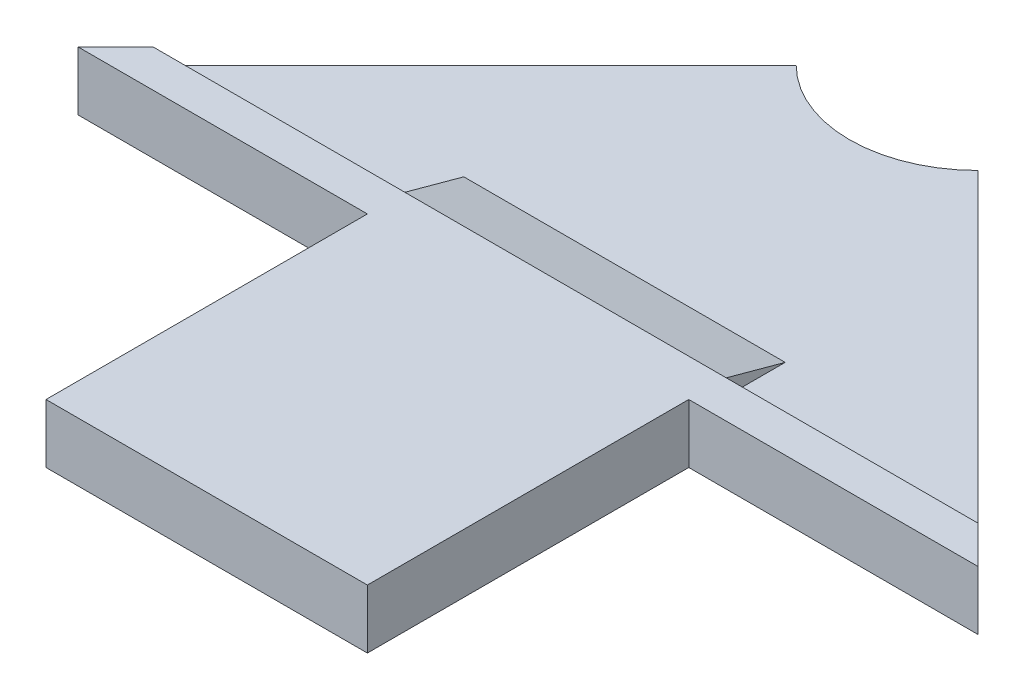
ISO-10303-21;
HEADER;
FILE_DESCRIPTION(('STEP AP214'),'2;1');
FILE_NAME('part.step','',(''),(''),'','','');
FILE_SCHEMA(('AUTOMOTIVE_DESIGN { 1 0 10303 214 1 1 1 1 }'));
ENDSEC;
DATA;
#1=APPLICATION_CONTEXT('core data for automotive mechanical design processes');
#2=APPLICATION_PROTOCOL_DEFINITION('international standard','automotive_design',2000,#1);
#3=PRODUCT_CONTEXT('',#1,'mechanical');
#4=PRODUCT('Part','Part','',(#3));
#5=PRODUCT_RELATED_PRODUCT_CATEGORY('part','',(#4));
#6=PRODUCT_DEFINITION_FORMATION('','',#4);
#7=PRODUCT_DEFINITION_CONTEXT('part definition',#1,'design');
#8=PRODUCT_DEFINITION('design','',#6,#7);
#9=PRODUCT_DEFINITION_SHAPE('','',#8);
#10=(LENGTH_UNIT() NAMED_UNIT(*) SI_UNIT(.MILLI.,.METRE.));
#11=(NAMED_UNIT(*) PLANE_ANGLE_UNIT() SI_UNIT($,.RADIAN.));
#12=(NAMED_UNIT(*) SI_UNIT($,.STERADIAN.) SOLID_ANGLE_UNIT());
#13=UNCERTAINTY_MEASURE_WITH_UNIT(LENGTH_MEASURE(1.E-05),#10,'distance_accuracy_value','');
#14=(GEOMETRIC_REPRESENTATION_CONTEXT(3) GLOBAL_UNCERTAINTY_ASSIGNED_CONTEXT((#13)) GLOBAL_UNIT_ASSIGNED_CONTEXT((#10,
#11,#12)) REPRESENTATION_CONTEXT('',''));
#15=CARTESIAN_POINT('',(0.,0.,0.));
#16=DIRECTION('',(0.,0.,1.));
#17=DIRECTION('',(1.,0.,0.));
#18=AXIS2_PLACEMENT_3D('',#15,#16,#17);
#19=CARTESIAN_POINT('',(0.,139.7,977.9));
#20=DIRECTION('',(0.,0.,-1.));
#21=DIRECTION('',(-1.,0.,0.));
#22=AXIS2_PLACEMENT_3D('',#19,#20,#21);
#23=PLANE('',#22);
#24=DIRECTION('',(1.,0.,0.));
#25=VECTOR('',#24,1.);
#26=CARTESIAN_POINT('',(0.,101.6,977.9));
#27=LINE('',#26,#25);
#28=CARTESIAN_POINT('',(381.,101.6,977.9));
#29=VERTEX_POINT('',#28);
#30=CARTESIAN_POINT('',(977.900000000001,101.6,977.900000000001));
#31=VERTEX_POINT('',#30);
#32=EDGE_CURVE('E196',#29,#31,#27,.T.);
#33=ORIENTED_EDGE('',*,*,#32,.F.);
#34=DIRECTION('',(0.,-1.,0.));
#35=VECTOR('',#34,1.);
#36=CARTESIAN_POINT('',(381.,101.6,977.9));
#37=LINE('',#36,#35);
#38=CARTESIAN_POINT('',(381.,139.7,977.9));
#39=VERTEX_POINT('',#38);
#40=EDGE_CURVE('E87',#39,#29,#37,.T.);
#41=ORIENTED_EDGE('',*,*,#40,.F.);
#42=DIRECTION('',(1.,0.,0.));
#43=VECTOR('',#42,1.);
#44=CARTESIAN_POINT('',(0.,139.7,977.9));
#45=LINE('',#44,#43);
#46=CARTESIAN_POINT('',(977.900000000001,139.7,977.900000000001));
#47=VERTEX_POINT('',#46);
#48=EDGE_CURVE('E220',#39,#47,#45,.T.);
#49=ORIENTED_EDGE('',*,*,#48,.T.);
#50=DIRECTION('',(0.,-1.,0.));
#51=VECTOR('',#50,1.);
#52=CARTESIAN_POINT('',(977.900000000001,139.7,977.900000000001));
#53=LINE('',#52,#51);
#54=EDGE_CURVE('E256',#47,#31,#53,.T.);
#55=ORIENTED_EDGE('',*,*,#54,.T.);
#56=EDGE_LOOP('',(#33,#41,#49,#55));
#57=FACE_BOUND('',#56,.T.);
#58=ADVANCED_FACE('F72',(#57),#23,.T.);
#59=CARTESIAN_POINT('',(381.,139.7,0.));
#60=DIRECTION('',(1.,0.,0.));
#61=DIRECTION('',(0.,0.,-1.));
#62=AXIS2_PLACEMENT_3D('',#59,#60,#61);
#63=PLANE('',#62);
#64=DIRECTION('',(0.,0.,1.));
#65=VECTOR('',#64,1.);
#66=CARTESIAN_POINT('',(381.,0.,0.));
#67=LINE('',#66,#65);
#68=CARTESIAN_POINT('',(381.,0.,1066.8));
#69=VERTEX_POINT('',#68);
#70=CARTESIAN_POINT('',(381.,0.,1828.8));
#71=VERTEX_POINT('',#70);
#72=EDGE_CURVE('E209',#69,#71,#67,.T.);
#73=ORIENTED_EDGE('',*,*,#72,.F.);
#74=DIRECTION('',(0.,-1.,0.));
#75=VECTOR('',#74,1.);
#76=CARTESIAN_POINT('',(381.,139.7,1066.8));
#77=LINE('',#76,#75);
#78=CARTESIAN_POINT('',(381.,139.7,1066.8));
#79=VERTEX_POINT('',#78);
#80=EDGE_CURVE('E12',#79,#69,#77,.T.);
#81=ORIENTED_EDGE('',*,*,#80,.F.);
#82=DIRECTION('',(0.,0.,1.));
#83=VECTOR('',#82,1.);
#84=CARTESIAN_POINT('',(381.,139.7,0.));
#85=LINE('',#84,#83);
#86=CARTESIAN_POINT('',(381.,139.7,1828.8));
#87=VERTEX_POINT('',#86);
#88=EDGE_CURVE('E210',#79,#87,#85,.T.);
#89=ORIENTED_EDGE('',*,*,#88,.T.);
#90=DIRECTION('',(0.,-1.,0.));
#91=VECTOR('',#90,1.);
#92=CARTESIAN_POINT('',(381.,139.7,1828.8));
#93=LINE('',#92,#91);
#94=EDGE_CURVE('E231',#87,#71,#93,.T.);
#95=ORIENTED_EDGE('',*,*,#94,.T.);
#96=EDGE_LOOP('',(#73,#81,#89,#95));
#97=FACE_BOUND('',#96,.T.);
#98=ADVANCED_FACE('F74',(#97),#63,.T.);
#99=CARTESIAN_POINT('',(6.90805437544542E-13,139.7,1066.8));
#100=DIRECTION('',(0.,0.,-1.));
#101=DIRECTION('',(-1.,0.,0.));
#102=AXIS2_PLACEMENT_3D('',#99,#100,#101);
#103=PLANE('',#102);
#104=DIRECTION('',(1.,0.,0.));
#105=VECTOR('',#104,1.);
#106=CARTESIAN_POINT('',(6.90805437544542E-13,0.,1066.8));
#107=LINE('',#106,#105);
#108=CARTESIAN_POINT('',(1066.8,0.,1066.8));
#109=VERTEX_POINT('',#108);
#110=EDGE_CURVE('E234',#69,#109,#107,.T.);
#111=ORIENTED_EDGE('',*,*,#110,.T.);
#112=DIRECTION('',(0.,-1.,0.));
#113=VECTOR('',#112,1.);
#114=CARTESIAN_POINT('',(1066.8,139.7,1066.8));
#115=LINE('',#114,#113);
#116=CARTESIAN_POINT('',(1066.8,139.7,1066.8));
#117=VERTEX_POINT('',#116);
#118=EDGE_CURVE('E80',#117,#109,#115,.T.);
#119=ORIENTED_EDGE('',*,*,#118,.F.);
#120=DIRECTION('',(1.,0.,0.));
#121=VECTOR('',#120,1.);
#122=CARTESIAN_POINT('',(6.90805437544542E-13,139.7,1066.8));
#123=LINE('',#122,#121);
#124=EDGE_CURVE('E213',#79,#117,#123,.T.);
#125=ORIENTED_EDGE('',*,*,#124,.F.);
#126=ORIENTED_EDGE('',*,*,#80,.T.);
#127=EDGE_LOOP('',(#111,#119,#125,#126));
#128=FACE_BOUND('',#127,.T.);
#129=ADVANCED_FACE('F284',(#128),#103,.F.);
#130=CARTESIAN_POINT('',(4.00373576964364E-12,139.7,-4.00373576964361E-12));
#131=DIRECTION('',(-0.70710678118655,0.,0.707106781186545));
#132=DIRECTION('',(0.707106781186545,0.,0.70710678118655));
#133=AXIS2_PLACEMENT_3D('',#130,#131,#132);
#134=PLANE('',#133);
#135=DIRECTION('',(-0.707106781186545,0.,-0.70710678118655));
#136=VECTOR('',#135,1.);
#137=CARTESIAN_POINT('',(4.00373576964364E-12,0.,-4.00373576964361E-12));
#138=LINE('',#137,#136);
#139=CARTESIAN_POINT('',(215.526146905659,0.,215.526146905659));
#140=VERTEX_POINT('',#139);
#141=EDGE_CURVE('E236',#109,#140,#138,.T.);
#142=ORIENTED_EDGE('',*,*,#141,.T.);
#143=DIRECTION('',(0.,-1.,0.));
#144=VECTOR('',#143,1.);
#145=CARTESIAN_POINT('',(215.526146905659,101.6,215.526146905659));
#146=LINE('',#145,#144);
#147=CARTESIAN_POINT('',(215.526146905659,101.6,215.526146905659));
#148=VERTEX_POINT('',#147);
#149=EDGE_CURVE('E201',#148,#140,#146,.T.);
#150=ORIENTED_EDGE('',*,*,#149,.F.);
#151=DIRECTION('',(0.707106781186548,0.,0.707106781186547));
#152=VECTOR('',#151,1.);
#153=CARTESIAN_POINT('',(0.,101.6,0.));
#154=LINE('',#153,#152);
#155=EDGE_CURVE('E198',#148,#31,#154,.T.);
#156=ORIENTED_EDGE('',*,*,#155,.T.);
#157=ORIENTED_EDGE('',*,*,#54,.F.);
#158=DIRECTION('',(-0.707106781186545,0.,-0.70710678118655));
#159=VECTOR('',#158,1.);
#160=CARTESIAN_POINT('',(4.00373576964364E-12,139.7,-4.00373576964361E-12));
#161=LINE('',#160,#159);
#162=EDGE_CURVE('E216',#117,#47,#161,.T.);
#163=ORIENTED_EDGE('',*,*,#162,.F.);
#164=ORIENTED_EDGE('',*,*,#118,.T.);
#165=EDGE_LOOP('',(#142,#150,#156,#157,#163,#164));
#166=FACE_BOUND('',#165,.T.);
#167=ADVANCED_FACE('F263',(#166),#134,.F.);
#168=DIRECTION('',(0.,-1.,0.));
#169=VECTOR('',#168,1.);
#170=CARTESIAN_POINT('',(-381.,101.6,977.9));
#171=LINE('',#170,#169);
#172=CARTESIAN_POINT('',(-381.,139.7,977.9));
#173=VERTEX_POINT('',#172);
#174=CARTESIAN_POINT('',(-381.,101.6,977.9));
#175=VERTEX_POINT('',#174);
#176=EDGE_CURVE('E183',#173,#175,#171,.T.);
#177=ORIENTED_EDGE('',*,*,#176,.T.);
#178=CARTESIAN_POINT('',(-977.9,101.6,977.9));
#179=VERTEX_POINT('',#178);
#180=EDGE_CURVE('E95',#179,#175,#27,.T.);
#181=ORIENTED_EDGE('',*,*,#180,.F.);
#182=DIRECTION('',(0.,-1.,0.));
#183=VECTOR('',#182,1.);
#184=CARTESIAN_POINT('',(-977.9,139.7,977.9));
#185=LINE('',#184,#183);
#186=CARTESIAN_POINT('',(-977.9,139.7,977.9));
#187=VERTEX_POINT('',#186);
#188=EDGE_CURVE('E254',#187,#179,#185,.T.);
#189=ORIENTED_EDGE('',*,*,#188,.F.);
#190=EDGE_CURVE('E221',#187,#173,#45,.T.);
#191=ORIENTED_EDGE('',*,*,#190,.T.);
#192=EDGE_LOOP('',(#177,#181,#189,#191));
#193=FACE_BOUND('',#192,.T.);
#194=ADVANCED_FACE('F304',(#193),#23,.T.);
#195=CARTESIAN_POINT('',(2.35513868802566E-13,139.7,2.35513868802566E-13));
#196=DIRECTION('',(-0.707106781186548,0.,-0.707106781186548));
#197=DIRECTION('',(-0.707106781186548,0.,0.707106781186548));
#198=AXIS2_PLACEMENT_3D('',#195,#196,#197);
#199=PLANE('',#198);
#200=DIRECTION('',(0.707106781186548,0.,-0.707106781186548));
#201=VECTOR('',#200,1.);
#202=CARTESIAN_POINT('',(2.35513868802566E-13,0.,2.35513868802566E-13));
#203=LINE('',#202,#201);
#204=CARTESIAN_POINT('',(-1066.8,0.,1066.8));
#205=VERTEX_POINT('',#204);
#206=CARTESIAN_POINT('',(-215.526146905659,0.,215.526146905659));
#207=VERTEX_POINT('',#206);
#208=EDGE_CURVE('E239',#205,#207,#203,.T.);
#209=ORIENTED_EDGE('',*,*,#208,.F.);
#210=DIRECTION('',(0.,-1.,0.));
#211=VECTOR('',#210,1.);
#212=CARTESIAN_POINT('',(-1066.8,139.7,1066.8));
#213=LINE('',#212,#211);
#214=CARTESIAN_POINT('',(-1066.8,139.7,1066.8));
#215=VERTEX_POINT('',#214);
#216=EDGE_CURVE('E252',#215,#205,#213,.T.);
#217=ORIENTED_EDGE('',*,*,#216,.F.);
#218=DIRECTION('',(0.707106781186548,0.,-0.707106781186548));
#219=VECTOR('',#218,1.);
#220=CARTESIAN_POINT('',(2.35513868802566E-13,139.7,2.35513868802566E-13));
#221=LINE('',#220,#219);
#222=EDGE_CURVE('E224',#215,#187,#221,.T.);
#223=ORIENTED_EDGE('',*,*,#222,.T.);
#224=ORIENTED_EDGE('',*,*,#188,.T.);
#225=DIRECTION('',(0.707106781186547,0.,-0.707106781186548));
#226=VECTOR('',#225,1.);
#227=CARTESIAN_POINT('',(0.,101.6,0.));
#228=LINE('',#227,#226);
#229=CARTESIAN_POINT('',(-215.526146905659,101.6,215.526146905659));
#230=VERTEX_POINT('',#229);
#231=EDGE_CURVE('E193',#179,#230,#228,.T.);
#232=ORIENTED_EDGE('',*,*,#231,.T.);
#233=DIRECTION('',(0.,-1.,0.));
#234=VECTOR('',#233,1.);
#235=CARTESIAN_POINT('',(-215.526146905659,101.6,215.526146905659));
#236=LINE('',#235,#234);
#237=EDGE_CURVE('E206',#230,#207,#236,.T.);
#238=ORIENTED_EDGE('',*,*,#237,.T.);
#239=EDGE_LOOP('',(#209,#217,#223,#224,#232,#238));
#240=FACE_BOUND('',#239,.T.);
#241=ADVANCED_FACE('F302',(#240),#199,.T.);
#242=CARTESIAN_POINT('',(-381.,0.,1066.8));
#243=VERTEX_POINT('',#242);
#244=EDGE_CURVE('E237',#205,#243,#107,.T.);
#245=ORIENTED_EDGE('',*,*,#244,.T.);
#246=DIRECTION('',(0.,-1.,0.));
#247=VECTOR('',#246,1.);
#248=CARTESIAN_POINT('',(-381.,139.7,1066.8));
#249=LINE('',#248,#247);
#250=CARTESIAN_POINT('',(-381.,139.7,1066.8));
#251=VERTEX_POINT('',#250);
#252=EDGE_CURVE('E249',#251,#243,#249,.T.);
#253=ORIENTED_EDGE('',*,*,#252,.F.);
#254=EDGE_CURVE('E217',#215,#251,#123,.T.);
#255=ORIENTED_EDGE('',*,*,#254,.F.);
#256=ORIENTED_EDGE('',*,*,#216,.T.);
#257=EDGE_LOOP('',(#245,#253,#255,#256));
#258=FACE_BOUND('',#257,.T.);
#259=ADVANCED_FACE('F299',(#258),#103,.F.);
#260=CARTESIAN_POINT('',(-381.,139.7,0.));
#261=DIRECTION('',(1.,0.,0.));
#262=DIRECTION('',(0.,0.,-1.));
#263=AXIS2_PLACEMENT_3D('',#260,#261,#262);
#264=PLANE('',#263);
#265=DIRECTION('',(0.,0.,1.));
#266=VECTOR('',#265,1.);
#267=CARTESIAN_POINT('',(-381.,0.,0.));
#268=LINE('',#267,#266);
#269=CARTESIAN_POINT('',(-381.,0.,1828.8));
#270=VERTEX_POINT('',#269);
#271=EDGE_CURVE('E241',#243,#270,#268,.T.);
#272=ORIENTED_EDGE('',*,*,#271,.T.);
#273=DIRECTION('',(0.,-1.,0.));
#274=VECTOR('',#273,1.);
#275=CARTESIAN_POINT('',(-381.,139.7,1828.8));
#276=LINE('',#275,#274);
#277=CARTESIAN_POINT('',(-381.,139.7,1828.8));
#278=VERTEX_POINT('',#277);
#279=EDGE_CURVE('E246',#278,#270,#276,.T.);
#280=ORIENTED_EDGE('',*,*,#279,.F.);
#281=DIRECTION('',(0.,0.,1.));
#282=VECTOR('',#281,1.);
#283=CARTESIAN_POINT('',(-381.,139.7,0.));
#284=LINE('',#283,#282);
#285=EDGE_CURVE('E227',#251,#278,#284,.T.);
#286=ORIENTED_EDGE('',*,*,#285,.F.);
#287=ORIENTED_EDGE('',*,*,#252,.T.);
#288=EDGE_LOOP('',(#272,#280,#286,#287));
#289=FACE_BOUND('',#288,.T.);
#290=ADVANCED_FACE('F295',(#289),#264,.F.);
#291=CARTESIAN_POINT('',(0.,139.7,1828.8));
#292=DIRECTION('',(0.,0.,-1.));
#293=DIRECTION('',(-1.,0.,0.));
#294=AXIS2_PLACEMENT_3D('',#291,#292,#293);
#295=PLANE('',#294);
#296=DIRECTION('',(1.,0.,0.));
#297=VECTOR('',#296,1.);
#298=CARTESIAN_POINT('',(0.,0.,1828.8));
#299=LINE('',#298,#297);
#300=EDGE_CURVE('E214',#270,#71,#299,.T.);
#301=ORIENTED_EDGE('',*,*,#300,.T.);
#302=ORIENTED_EDGE('',*,*,#94,.F.);
#303=DIRECTION('',(1.,0.,0.));
#304=VECTOR('',#303,1.);
#305=CARTESIAN_POINT('',(0.,139.7,1828.8));
#306=LINE('',#305,#304);
#307=EDGE_CURVE('E229',#278,#87,#306,.T.);
#308=ORIENTED_EDGE('',*,*,#307,.F.);
#309=ORIENTED_EDGE('',*,*,#279,.T.);
#310=EDGE_LOOP('',(#301,#302,#308,#309));
#311=FACE_BOUND('',#310,.T.);
#312=ADVANCED_FACE('F290',(#311),#295,.F.);
#313=CARTESIAN_POINT('',(0.,139.7,0.));
#314=DIRECTION('',(0.,1.,0.));
#315=DIRECTION('',(0.,0.,1.));
#316=AXIS2_PLACEMENT_3D('',#313,#314,#315);
#317=PLANE('',#316);
#318=ORIENTED_EDGE('',*,*,#88,.F.);
#319=ORIENTED_EDGE('',*,*,#124,.T.);
#320=ORIENTED_EDGE('',*,*,#162,.T.);
#321=ORIENTED_EDGE('',*,*,#48,.F.);
#322=DIRECTION('',(1.,0.,0.));
#323=VECTOR('',#322,1.);
#324=CARTESIAN_POINT('',(-381.,139.7,977.9));
#325=LINE('',#324,#323);
#326=EDGE_CURVE('E173',#173,#39,#325,.T.);
#327=ORIENTED_EDGE('',*,*,#326,.F.);
#328=ORIENTED_EDGE('',*,*,#190,.F.);
#329=ORIENTED_EDGE('',*,*,#222,.F.);
#330=ORIENTED_EDGE('',*,*,#254,.T.);
#331=ORIENTED_EDGE('',*,*,#285,.T.);
#332=ORIENTED_EDGE('',*,*,#307,.T.);
#333=EDGE_LOOP('',(#318,#319,#320,#321,#327,#328,#329,#330,#331,#332));
#334=FACE_BOUND('',#333,.T.);
#335=ADVANCED_FACE('F283',(#334),#317,.T.);
#336=CARTESIAN_POINT('',(0.,0.,0.));
#337=DIRECTION('',(0.,1.,0.));
#338=DIRECTION('',(0.,0.,1.));
#339=AXIS2_PLACEMENT_3D('',#336,#337,#338);
#340=PLANE('',#339);
#341=ORIENTED_EDGE('',*,*,#72,.T.);
#342=ORIENTED_EDGE('',*,*,#300,.F.);
#343=ORIENTED_EDGE('',*,*,#271,.F.);
#344=ORIENTED_EDGE('',*,*,#244,.F.);
#345=ORIENTED_EDGE('',*,*,#208,.T.);
#346=CARTESIAN_POINT('',(0.,0.,-7.7715611723761E-13));
#347=DIRECTION('',(0.,1.,0.));
#348=DIRECTION('',(0.,0.,1.));
#349=AXIS2_PLACEMENT_3D('',#346,#347,#348);
#350=CIRCLE('',#349,304.8);
#351=EDGE_CURVE('E185',#207,#140,#350,.T.);
#352=ORIENTED_EDGE('',*,*,#351,.T.);
#353=ORIENTED_EDGE('',*,*,#141,.F.);
#354=ORIENTED_EDGE('',*,*,#110,.F.);
#355=EDGE_LOOP('',(#341,#342,#343,#344,#345,#352,#353,#354));
#356=FACE_BOUND('',#355,.T.);
#357=ADVANCED_FACE('F269',(#356),#340,.F.);
#358=CARTESIAN_POINT('',(0.,101.6,-7.7715611723761E-13));
#359=DIRECTION('',(0.,-1.,0.));
#360=DIRECTION('',(0.,0.,-1.));
#361=AXIS2_PLACEMENT_3D('',#358,#359,#360);
#362=CYLINDRICAL_SURFACE('',#361,304.8);
#363=ORIENTED_EDGE('',*,*,#351,.F.);
#364=ORIENTED_EDGE('',*,*,#237,.F.);
#365=CARTESIAN_POINT('',(0.,101.6,-7.7715611723761E-13));
#366=DIRECTION('',(0.,1.,0.));
#367=DIRECTION('',(0.,0.,1.));
#368=AXIS2_PLACEMENT_3D('',#365,#366,#367);
#369=CIRCLE('',#368,304.8);
#370=EDGE_CURVE('E190',#230,#148,#369,.T.);
#371=ORIENTED_EDGE('',*,*,#370,.T.);
#372=ORIENTED_EDGE('',*,*,#149,.T.);
#373=EDGE_LOOP('',(#363,#364,#371,#372));
#374=FACE_BOUND('',#373,.T.);
#375=ADVANCED_FACE('F275',(#374),#362,.F.);
#376=CARTESIAN_POINT('',(0.,101.6,0.));
#377=DIRECTION('',(0.,1.,0.));
#378=DIRECTION('',(0.,0.,1.));
#379=AXIS2_PLACEMENT_3D('',#376,#377,#378);
#380=PLANE('',#379);
#381=DIRECTION('',(0.,0.,-1.));
#382=VECTOR('',#381,1.);
#383=CARTESIAN_POINT('',(-381.,101.6,838.200000000001));
#384=LINE('',#383,#382);
#385=CARTESIAN_POINT('',(-381.,101.6,838.200000000001));
#386=VERTEX_POINT('',#385);
#387=EDGE_CURVE('E182',#175,#386,#384,.T.);
#388=ORIENTED_EDGE('',*,*,#387,.T.);
#389=DIRECTION('',(1.,0.,0.));
#390=VECTOR('',#389,1.);
#391=CARTESIAN_POINT('',(-381.,101.6,838.200000000001));
#392=LINE('',#391,#390);
#393=CARTESIAN_POINT('',(381.,101.6,838.200000000001));
#394=VERTEX_POINT('',#393);
#395=EDGE_CURVE('E170',#386,#394,#392,.T.);
#396=ORIENTED_EDGE('',*,*,#395,.T.);
#397=DIRECTION('',(0.,0.,-1.));
#398=VECTOR('',#397,1.);
#399=CARTESIAN_POINT('',(381.,101.6,838.200000000001));
#400=LINE('',#399,#398);
#401=EDGE_CURVE('E174',#29,#394,#400,.T.);
#402=ORIENTED_EDGE('',*,*,#401,.F.);
#403=ORIENTED_EDGE('',*,*,#32,.T.);
#404=ORIENTED_EDGE('',*,*,#155,.F.);
#405=ORIENTED_EDGE('',*,*,#370,.F.);
#406=ORIENTED_EDGE('',*,*,#231,.F.);
#407=ORIENTED_EDGE('',*,*,#180,.T.);
#408=EDGE_LOOP('',(#388,#396,#402,#403,#404,#405,#406,#407));
#409=FACE_BOUND('',#408,.T.);
#410=ADVANCED_FACE('F181',(#409),#380,.T.);
#411=CARTESIAN_POINT('',(-381.,139.7,977.9));
#412=DIRECTION('',(0.,0.964763821237732,-0.263117405792109));
#413=DIRECTION('',(0.,0.263117405792109,0.964763821237732));
#414=AXIS2_PLACEMENT_3D('',#411,#412,#413);
#415=PLANE('',#414);
#416=ORIENTED_EDGE('',*,*,#326,.T.);
#417=DIRECTION('',(0.,0.263117405792109,0.964763821237732));
#418=VECTOR('',#417,1.);
#419=CARTESIAN_POINT('',(381.,139.7,977.9));
#420=LINE('',#419,#418);
#421=EDGE_CURVE('E167',#394,#39,#420,.T.);
#422=ORIENTED_EDGE('',*,*,#421,.F.);
#423=ORIENTED_EDGE('',*,*,#395,.F.);
#424=DIRECTION('',(0.,0.263117405792109,0.964763821237732));
#425=VECTOR('',#424,1.);
#426=CARTESIAN_POINT('',(-381.,139.7,977.9));
#427=LINE('',#426,#425);
#428=EDGE_CURVE('E187',#386,#173,#427,.T.);
#429=ORIENTED_EDGE('',*,*,#428,.T.);
#430=EDGE_LOOP('',(#416,#422,#423,#429));
#431=FACE_BOUND('',#430,.T.);
#432=ADVANCED_FACE('F168',(#431),#415,.T.);
#433=CARTESIAN_POINT('',(-381.,0.,0.));
#434=DIRECTION('',(-1.,0.,0.));
#435=DIRECTION('',(0.,0.,1.));
#436=AXIS2_PLACEMENT_3D('',#433,#434,#435);
#437=PLANE('',#436);
#438=ORIENTED_EDGE('',*,*,#387,.F.);
#439=ORIENTED_EDGE('',*,*,#176,.F.);
#440=ORIENTED_EDGE('',*,*,#428,.F.);
#441=EDGE_LOOP('',(#438,#439,#440));
#442=FACE_BOUND('',#441,.T.);
#443=ADVANCED_FACE('F307',(#442),#437,.T.);
#444=CARTESIAN_POINT('',(381.,0.,0.));
#445=DIRECTION('',(-1.,0.,0.));
#446=DIRECTION('',(0.,0.,1.));
#447=AXIS2_PLACEMENT_3D('',#444,#445,#446);
#448=PLANE('',#447);
#449=ORIENTED_EDGE('',*,*,#401,.T.);
#450=ORIENTED_EDGE('',*,*,#421,.T.);
#451=ORIENTED_EDGE('',*,*,#40,.T.);
#452=EDGE_LOOP('',(#449,#450,#451));
#453=FACE_BOUND('',#452,.T.);
#454=ADVANCED_FACE('F176',(#453),#448,.F.);
#455=CLOSED_SHELL('',(#58,#98,#129,#167,#194,#241,#259,#290,#312,#335,#357,#375,#410,#432,#443,#454));
#456=MANIFOLD_SOLID_BREP('B2',#455);
#457=ADVANCED_BREP_SHAPE_REPRESENTATION('',(#18,#456),#14);
#458=SHAPE_DEFINITION_REPRESENTATION(#9,#457);
ENDSEC;
END-ISO-10303-21;
